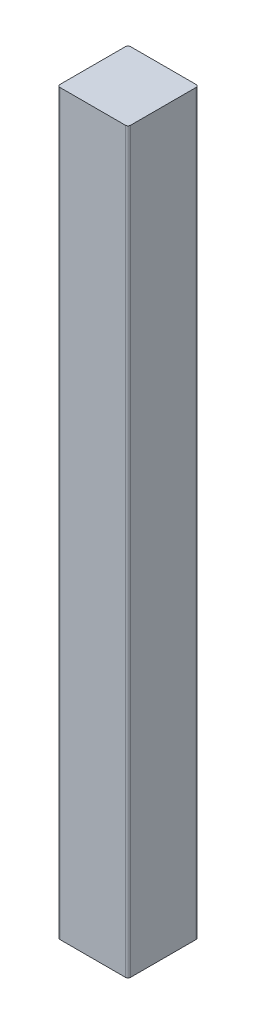
ISO-10303-21;
HEADER;
FILE_DESCRIPTION(('STEP AP214'),'2;1');
FILE_NAME('part.step','',(''),(''),'','','');
FILE_SCHEMA(('AUTOMOTIVE_DESIGN { 1 0 10303 214 1 1 1 1 }'));
ENDSEC;
DATA;
#1=APPLICATION_CONTEXT('core data for automotive mechanical design processes');
#2=APPLICATION_PROTOCOL_DEFINITION('international standard','automotive_design',2000,#1);
#3=PRODUCT_CONTEXT('',#1,'mechanical');
#4=PRODUCT('Part','Part','',(#3));
#5=PRODUCT_RELATED_PRODUCT_CATEGORY('part','',(#4));
#6=PRODUCT_DEFINITION_FORMATION('','',#4);
#7=PRODUCT_DEFINITION_CONTEXT('part definition',#1,'design');
#8=PRODUCT_DEFINITION('design','',#6,#7);
#9=PRODUCT_DEFINITION_SHAPE('','',#8);
#10=(LENGTH_UNIT() NAMED_UNIT(*) SI_UNIT(.MILLI.,.METRE.));
#11=(NAMED_UNIT(*) PLANE_ANGLE_UNIT() SI_UNIT($,.RADIAN.));
#12=(NAMED_UNIT(*) SI_UNIT($,.STERADIAN.) SOLID_ANGLE_UNIT());
#13=UNCERTAINTY_MEASURE_WITH_UNIT(LENGTH_MEASURE(1.E-05),#10,'distance_accuracy_value','');
#14=(GEOMETRIC_REPRESENTATION_CONTEXT(3) GLOBAL_UNCERTAINTY_ASSIGNED_CONTEXT((#13)) GLOBAL_UNIT_ASSIGNED_CONTEXT((#10,
#11,#12)) REPRESENTATION_CONTEXT('',''));
#15=CARTESIAN_POINT('',(0.,0.,0.));
#16=DIRECTION('',(0.,0.,1.));
#17=DIRECTION('',(1.,0.,0.));
#18=AXIS2_PLACEMENT_3D('',#15,#16,#17);
#19=CARTESIAN_POINT('',(44.45,928.6875,-44.45));
#20=DIRECTION('',(-1.,0.,0.));
#21=DIRECTION('',(0.,0.,1.));
#22=AXIS2_PLACEMENT_3D('',#19,#20,#21);
#23=PLANE('',#22);
#24=DIRECTION('',(0.,0.,-1.));
#25=VECTOR('',#24,1.);
#26=CARTESIAN_POINT('',(44.45,0.,-44.45));
#27=LINE('',#26,#25);
#28=CARTESIAN_POINT('',(44.45,0.,41.275));
#29=VERTEX_POINT('',#28);
#30=CARTESIAN_POINT('',(44.45,0.,-41.275));
#31=VERTEX_POINT('',#30);
#32=EDGE_CURVE('E157',#29,#31,#27,.T.);
#33=ORIENTED_EDGE('',*,*,#32,.T.);
#34=DIRECTION('',(0.,-1.,0.));
#35=VECTOR('',#34,1.);
#36=CARTESIAN_POINT('',(44.45,928.6875,-41.275));
#37=LINE('',#36,#35);
#38=CARTESIAN_POINT('',(44.45,928.6875,-41.275));
#39=VERTEX_POINT('',#38);
#40=EDGE_CURVE('E11',#31,#39,#37,.F.);
#41=ORIENTED_EDGE('',*,*,#40,.T.);
#42=DIRECTION('',(0.,0.,-1.));
#43=VECTOR('',#42,1.);
#44=CARTESIAN_POINT('',(44.45,928.6875,-44.45));
#45=LINE('',#44,#43);
#46=CARTESIAN_POINT('',(44.45,928.6875,41.275));
#47=VERTEX_POINT('',#46);
#48=EDGE_CURVE('E125',#47,#39,#45,.T.);
#49=ORIENTED_EDGE('',*,*,#48,.F.);
#50=DIRECTION('',(0.,-1.,0.));
#51=VECTOR('',#50,1.);
#52=CARTESIAN_POINT('',(44.45,928.6875,41.275));
#53=LINE('',#52,#51);
#54=EDGE_CURVE('E41',#47,#29,#53,.T.);
#55=ORIENTED_EDGE('',*,*,#54,.T.);
#56=EDGE_LOOP('',(#33,#41,#49,#55));
#57=FACE_BOUND('',#56,.T.);
#58=ADVANCED_FACE('F33',(#57),#23,.F.);
#59=CARTESIAN_POINT('',(-44.45,928.6875,-44.45));
#60=DIRECTION('',(0.,0.,1.));
#61=DIRECTION('',(1.,0.,0.));
#62=AXIS2_PLACEMENT_3D('',#59,#60,#61);
#63=PLANE('',#62);
#64=DIRECTION('',(-1.,0.,0.));
#65=VECTOR('',#64,1.);
#66=CARTESIAN_POINT('',(-44.45,0.,-44.45));
#67=LINE('',#66,#65);
#68=CARTESIAN_POINT('',(41.275,0.,-44.45));
#69=VERTEX_POINT('',#68);
#70=CARTESIAN_POINT('',(-41.275,0.,-44.45));
#71=VERTEX_POINT('',#70);
#72=EDGE_CURVE('E130',#69,#71,#67,.T.);
#73=ORIENTED_EDGE('',*,*,#72,.T.);
#74=DIRECTION('',(0.,-1.,0.));
#75=VECTOR('',#74,1.);
#76=CARTESIAN_POINT('',(-41.275,928.6875,-44.45));
#77=LINE('',#76,#75);
#78=CARTESIAN_POINT('',(-41.275,928.6875,-44.45));
#79=VERTEX_POINT('',#78);
#80=EDGE_CURVE('E48',#71,#79,#77,.F.);
#81=ORIENTED_EDGE('',*,*,#80,.T.);
#82=DIRECTION('',(-1.,0.,0.));
#83=VECTOR('',#82,1.);
#84=CARTESIAN_POINT('',(-44.45,928.6875,-44.45));
#85=LINE('',#84,#83);
#86=CARTESIAN_POINT('',(41.275,928.6875,-44.45));
#87=VERTEX_POINT('',#86);
#88=EDGE_CURVE('E128',#87,#79,#85,.T.);
#89=ORIENTED_EDGE('',*,*,#88,.F.);
#90=DIRECTION('',(0.,-1.,0.));
#91=VECTOR('',#90,1.);
#92=CARTESIAN_POINT('',(41.275,928.6875,-44.45));
#93=LINE('',#92,#91);
#94=EDGE_CURVE('E149',#87,#69,#93,.T.);
#95=ORIENTED_EDGE('',*,*,#94,.T.);
#96=EDGE_LOOP('',(#73,#81,#89,#95));
#97=FACE_BOUND('',#96,.T.);
#98=ADVANCED_FACE('F177',(#97),#63,.F.);
#99=CARTESIAN_POINT('',(-44.45,928.6875,-44.45));
#100=DIRECTION('',(1.,0.,0.));
#101=DIRECTION('',(0.,0.,-1.));
#102=AXIS2_PLACEMENT_3D('',#99,#100,#101);
#103=PLANE('',#102);
#104=DIRECTION('',(0.,0.,1.));
#105=VECTOR('',#104,1.);
#106=CARTESIAN_POINT('',(-44.45,0.,-44.45));
#107=LINE('',#106,#105);
#108=CARTESIAN_POINT('',(-44.45,0.,-41.275));
#109=VERTEX_POINT('',#108);
#110=CARTESIAN_POINT('',(-44.45,0.,41.275));
#111=VERTEX_POINT('',#110);
#112=EDGE_CURVE('E126',#109,#111,#107,.T.);
#113=ORIENTED_EDGE('',*,*,#112,.T.);
#114=DIRECTION('',(0.,-1.,0.));
#115=VECTOR('',#114,1.);
#116=CARTESIAN_POINT('',(-44.45,928.6875,41.275));
#117=LINE('',#116,#115);
#118=CARTESIAN_POINT('',(-44.45,928.6875,41.275));
#119=VERTEX_POINT('',#118);
#120=EDGE_CURVE('E104',#111,#119,#117,.F.);
#121=ORIENTED_EDGE('',*,*,#120,.T.);
#122=DIRECTION('',(0.,0.,1.));
#123=VECTOR('',#122,1.);
#124=CARTESIAN_POINT('',(-44.45,928.6875,-44.45));
#125=LINE('',#124,#123);
#126=CARTESIAN_POINT('',(-44.45,928.6875,-41.275));
#127=VERTEX_POINT('',#126);
#128=EDGE_CURVE('E165',#127,#119,#125,.T.);
#129=ORIENTED_EDGE('',*,*,#128,.F.);
#130=DIRECTION('',(0.,-1.,0.));
#131=VECTOR('',#130,1.);
#132=CARTESIAN_POINT('',(-44.45,928.6875,-41.275));
#133=LINE('',#132,#131);
#134=EDGE_CURVE('E109',#127,#109,#133,.T.);
#135=ORIENTED_EDGE('',*,*,#134,.T.);
#136=EDGE_LOOP('',(#113,#121,#129,#135));
#137=FACE_BOUND('',#136,.T.);
#138=ADVANCED_FACE('F176',(#137),#103,.F.);
#139=CARTESIAN_POINT('',(-44.45,928.6875,44.45));
#140=DIRECTION('',(0.,0.,-1.));
#141=DIRECTION('',(-1.,0.,0.));
#142=AXIS2_PLACEMENT_3D('',#139,#140,#141);
#143=PLANE('',#142);
#144=DIRECTION('',(1.,0.,0.));
#145=VECTOR('',#144,1.);
#146=CARTESIAN_POINT('',(-44.45,928.6875,44.45));
#147=LINE('',#146,#145);
#148=CARTESIAN_POINT('',(-41.275,928.6875,44.45));
#149=VERTEX_POINT('',#148);
#150=CARTESIAN_POINT('',(41.275,928.6875,44.45));
#151=VERTEX_POINT('',#150);
#152=EDGE_CURVE('E119',#149,#151,#147,.T.);
#153=ORIENTED_EDGE('',*,*,#152,.F.);
#154=DIRECTION('',(0.,-1.,0.));
#155=VECTOR('',#154,1.);
#156=CARTESIAN_POINT('',(-41.275,928.6875,44.45));
#157=LINE('',#156,#155);
#158=CARTESIAN_POINT('',(-41.275,0.,44.45));
#159=VERTEX_POINT('',#158);
#160=EDGE_CURVE('E103',#149,#159,#157,.T.);
#161=ORIENTED_EDGE('',*,*,#160,.T.);
#162=DIRECTION('',(1.,0.,0.));
#163=VECTOR('',#162,1.);
#164=CARTESIAN_POINT('',(-44.45,0.,44.45));
#165=LINE('',#164,#163);
#166=CARTESIAN_POINT('',(41.275,0.,44.45));
#167=VERTEX_POINT('',#166);
#168=EDGE_CURVE('E116',#159,#167,#165,.T.);
#169=ORIENTED_EDGE('',*,*,#168,.T.);
#170=DIRECTION('',(0.,-1.,0.));
#171=VECTOR('',#170,1.);
#172=CARTESIAN_POINT('',(41.275,928.6875,44.45));
#173=LINE('',#172,#171);
#174=EDGE_CURVE('E121',#167,#151,#173,.F.);
#175=ORIENTED_EDGE('',*,*,#174,.T.);
#176=EDGE_LOOP('',(#153,#161,#169,#175));
#177=FACE_BOUND('',#176,.T.);
#178=ADVANCED_FACE('F115',(#177),#143,.F.);
#179=CARTESIAN_POINT('',(0.,928.6875,0.));
#180=DIRECTION('',(0.,1.,0.));
#181=DIRECTION('',(0.,0.,1.));
#182=AXIS2_PLACEMENT_3D('',#179,#180,#181);
#183=PLANE('',#182);
#184=ORIENTED_EDGE('',*,*,#128,.T.);
#185=CARTESIAN_POINT('',(-41.275,928.6875,41.275));
#186=DIRECTION('',(0.,1.,0.));
#187=DIRECTION('',(0.,0.,1.));
#188=AXIS2_PLACEMENT_3D('',#185,#186,#187);
#189=CIRCLE('',#188,3.175);
#190=EDGE_CURVE('E147',#119,#149,#189,.T.);
#191=ORIENTED_EDGE('',*,*,#190,.T.);
#192=ORIENTED_EDGE('',*,*,#152,.T.);
#193=CARTESIAN_POINT('',(41.275,928.6875,41.275));
#194=DIRECTION('',(0.,1.,0.));
#195=DIRECTION('',(0.,0.,1.));
#196=AXIS2_PLACEMENT_3D('',#193,#194,#195);
#197=CIRCLE('',#196,3.175);
#198=EDGE_CURVE('E142',#151,#47,#197,.T.);
#199=ORIENTED_EDGE('',*,*,#198,.T.);
#200=ORIENTED_EDGE('',*,*,#48,.T.);
#201=CARTESIAN_POINT('',(41.275,928.6875,-41.275));
#202=DIRECTION('',(0.,1.,0.));
#203=DIRECTION('',(0.,0.,1.));
#204=AXIS2_PLACEMENT_3D('',#201,#202,#203);
#205=CIRCLE('',#204,3.175);
#206=EDGE_CURVE('E55',#39,#87,#205,.T.);
#207=ORIENTED_EDGE('',*,*,#206,.T.);
#208=ORIENTED_EDGE('',*,*,#88,.T.);
#209=CARTESIAN_POINT('',(-41.275,928.6875,-41.275));
#210=DIRECTION('',(0.,1.,0.));
#211=DIRECTION('',(0.,0.,1.));
#212=AXIS2_PLACEMENT_3D('',#209,#210,#211);
#213=CIRCLE('',#212,3.175);
#214=EDGE_CURVE('E145',#79,#127,#213,.T.);
#215=ORIENTED_EDGE('',*,*,#214,.T.);
#216=EDGE_LOOP('',(#184,#191,#192,#199,#200,#207,#208,#215));
#217=FACE_BOUND('',#216,.T.);
#218=ADVANCED_FACE('F169',(#217),#183,.T.);
#219=CARTESIAN_POINT('',(0.,0.,0.));
#220=DIRECTION('',(0.,1.,0.));
#221=DIRECTION('',(0.,0.,1.));
#222=AXIS2_PLACEMENT_3D('',#219,#220,#221);
#223=PLANE('',#222);
#224=ORIENTED_EDGE('',*,*,#168,.F.);
#225=CARTESIAN_POINT('',(-41.275,0.,41.275));
#226=DIRECTION('',(0.,1.,0.));
#227=DIRECTION('',(0.,0.,1.));
#228=AXIS2_PLACEMENT_3D('',#225,#226,#227);
#229=CIRCLE('',#228,3.175);
#230=EDGE_CURVE('E99',#159,#111,#229,.F.);
#231=ORIENTED_EDGE('',*,*,#230,.T.);
#232=ORIENTED_EDGE('',*,*,#112,.F.);
#233=CARTESIAN_POINT('',(-41.275,0.,-41.275));
#234=DIRECTION('',(0.,1.,0.));
#235=DIRECTION('',(0.,0.,1.));
#236=AXIS2_PLACEMENT_3D('',#233,#234,#235);
#237=CIRCLE('',#236,3.175);
#238=EDGE_CURVE('E110',#109,#71,#237,.F.);
#239=ORIENTED_EDGE('',*,*,#238,.T.);
#240=ORIENTED_EDGE('',*,*,#72,.F.);
#241=CARTESIAN_POINT('',(41.275,0.,-41.275));
#242=DIRECTION('',(0.,1.,0.));
#243=DIRECTION('',(0.,0.,1.));
#244=AXIS2_PLACEMENT_3D('',#241,#242,#243);
#245=CIRCLE('',#244,3.175);
#246=EDGE_CURVE('E136',#69,#31,#245,.F.);
#247=ORIENTED_EDGE('',*,*,#246,.T.);
#248=ORIENTED_EDGE('',*,*,#32,.F.);
#249=CARTESIAN_POINT('',(41.275,0.,41.275));
#250=DIRECTION('',(0.,1.,0.));
#251=DIRECTION('',(0.,0.,1.));
#252=AXIS2_PLACEMENT_3D('',#249,#250,#251);
#253=CIRCLE('',#252,3.175);
#254=EDGE_CURVE('E120',#29,#167,#253,.F.);
#255=ORIENTED_EDGE('',*,*,#254,.T.);
#256=EDGE_LOOP('',(#224,#231,#232,#239,#240,#247,#248,#255));
#257=FACE_BOUND('',#256,.T.);
#258=ADVANCED_FACE('F123',(#257),#223,.F.);
#259=CARTESIAN_POINT('',(-41.275,928.6875,41.275));
#260=DIRECTION('',(0.,-1.,0.));
#261=DIRECTION('',(0.,0.,-1.));
#262=AXIS2_PLACEMENT_3D('',#259,#260,#261);
#263=CYLINDRICAL_SURFACE('',#262,3.175);
#264=ORIENTED_EDGE('',*,*,#190,.F.);
#265=ORIENTED_EDGE('',*,*,#120,.F.);
#266=ORIENTED_EDGE('',*,*,#230,.F.);
#267=ORIENTED_EDGE('',*,*,#160,.F.);
#268=EDGE_LOOP('',(#264,#265,#266,#267));
#269=FACE_BOUND('',#268,.T.);
#270=ADVANCED_FACE('F102',(#269),#263,.T.);
#271=CARTESIAN_POINT('',(-41.275,928.6875,-41.275));
#272=DIRECTION('',(0.,-1.,0.));
#273=DIRECTION('',(0.,0.,-1.));
#274=AXIS2_PLACEMENT_3D('',#271,#272,#273);
#275=CYLINDRICAL_SURFACE('',#274,3.175);
#276=ORIENTED_EDGE('',*,*,#214,.F.);
#277=ORIENTED_EDGE('',*,*,#80,.F.);
#278=ORIENTED_EDGE('',*,*,#238,.F.);
#279=ORIENTED_EDGE('',*,*,#134,.F.);
#280=EDGE_LOOP('',(#276,#277,#278,#279));
#281=FACE_BOUND('',#280,.T.);
#282=ADVANCED_FACE('F174',(#281),#275,.T.);
#283=CARTESIAN_POINT('',(41.275,928.6875,-41.275));
#284=DIRECTION('',(0.,-1.,0.));
#285=DIRECTION('',(0.,0.,-1.));
#286=AXIS2_PLACEMENT_3D('',#283,#284,#285);
#287=CYLINDRICAL_SURFACE('',#286,3.175);
#288=ORIENTED_EDGE('',*,*,#206,.F.);
#289=ORIENTED_EDGE('',*,*,#40,.F.);
#290=ORIENTED_EDGE('',*,*,#246,.F.);
#291=ORIENTED_EDGE('',*,*,#94,.F.);
#292=EDGE_LOOP('',(#288,#289,#290,#291));
#293=FACE_BOUND('',#292,.T.);
#294=ADVANCED_FACE('F179',(#293),#287,.T.);
#295=CARTESIAN_POINT('',(41.275,928.6875,41.275));
#296=DIRECTION('',(0.,-1.,0.));
#297=DIRECTION('',(0.,0.,-1.));
#298=AXIS2_PLACEMENT_3D('',#295,#296,#297);
#299=CYLINDRICAL_SURFACE('',#298,3.175);
#300=ORIENTED_EDGE('',*,*,#198,.F.);
#301=ORIENTED_EDGE('',*,*,#174,.F.);
#302=ORIENTED_EDGE('',*,*,#254,.F.);
#303=ORIENTED_EDGE('',*,*,#54,.F.);
#304=EDGE_LOOP('',(#300,#301,#302,#303));
#305=FACE_BOUND('',#304,.T.);
#306=ADVANCED_FACE('F35',(#305),#299,.T.);
#307=CLOSED_SHELL('',(#58,#98,#138,#178,#218,#258,#270,#282,#294,#306));
#308=MANIFOLD_SOLID_BREP('B2',#307);
#309=ADVANCED_BREP_SHAPE_REPRESENTATION('',(#18,#308),#14);
#310=SHAPE_DEFINITION_REPRESENTATION(#9,#309);
ENDSEC;
END-ISO-10303-21;
